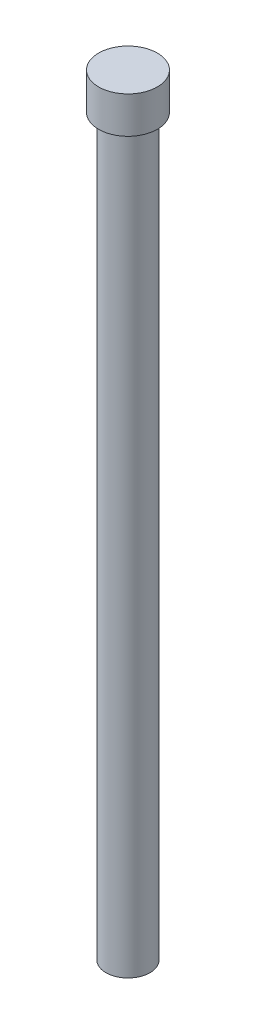
ISO-10303-21;
HEADER;
FILE_DESCRIPTION(('STEP AP214'),'2;1');
FILE_NAME('part.step','',(''),(''),'','','');
FILE_SCHEMA(('AUTOMOTIVE_DESIGN { 1 0 10303 214 1 1 1 1 }'));
ENDSEC;
DATA;
#1=APPLICATION_CONTEXT('core data for automotive mechanical design processes');
#2=APPLICATION_PROTOCOL_DEFINITION('international standard','automotive_design',2000,#1);
#3=PRODUCT_CONTEXT('',#1,'mechanical');
#4=PRODUCT('Part','Part','',(#3));
#5=PRODUCT_RELATED_PRODUCT_CATEGORY('part','',(#4));
#6=PRODUCT_DEFINITION_FORMATION('','',#4);
#7=PRODUCT_DEFINITION_CONTEXT('part definition',#1,'design');
#8=PRODUCT_DEFINITION('design','',#6,#7);
#9=PRODUCT_DEFINITION_SHAPE('','',#8);
#10=(LENGTH_UNIT() NAMED_UNIT(*) SI_UNIT(.MILLI.,.METRE.));
#11=(NAMED_UNIT(*) PLANE_ANGLE_UNIT() SI_UNIT($,.RADIAN.));
#12=(NAMED_UNIT(*) SI_UNIT($,.STERADIAN.) SOLID_ANGLE_UNIT());
#13=UNCERTAINTY_MEASURE_WITH_UNIT(LENGTH_MEASURE(1.E-05),#10,'distance_accuracy_value','');
#14=(GEOMETRIC_REPRESENTATION_CONTEXT(3) GLOBAL_UNCERTAINTY_ASSIGNED_CONTEXT((#13)) GLOBAL_UNIT_ASSIGNED_CONTEXT((#10,
#11,#12)) REPRESENTATION_CONTEXT('',''));
#15=CARTESIAN_POINT('',(0.,0.,0.));
#16=DIRECTION('',(0.,0.,1.));
#17=DIRECTION('',(1.,0.,0.));
#18=AXIS2_PLACEMENT_3D('',#15,#16,#17);
#19=CARTESIAN_POINT('',(0.,25.4,0.));
#20=DIRECTION('',(0.,-1.,0.));
#21=DIRECTION('',(0.,0.,-1.));
#22=AXIS2_PLACEMENT_3D('',#19,#20,#21);
#23=CYLINDRICAL_SURFACE('',#22,0.762);
#24=CARTESIAN_POINT('',(0.,25.4,0.));
#25=DIRECTION('',(0.,1.,0.));
#26=DIRECTION('',(0.,0.,1.));
#27=AXIS2_PLACEMENT_3D('',#24,#25,#26);
#28=CIRCLE('',#27,0.762);
#29=CARTESIAN_POINT('',(0.,25.4,0.762));
#30=VERTEX_POINT('',#29);
#31=EDGE_CURVE('E10',#30,#30,#28,.T.);
#32=ORIENTED_EDGE('',*,*,#31,.F.);
#33=EDGE_LOOP('',(#32));
#34=FACE_BOUND('',#33,.T.);
#35=CARTESIAN_POINT('',(0.,0.,0.));
#36=DIRECTION('',(0.,1.,0.));
#37=DIRECTION('',(0.,0.,1.));
#38=AXIS2_PLACEMENT_3D('',#35,#36,#37);
#39=CIRCLE('',#38,0.762);
#40=CARTESIAN_POINT('',(0.,0.,0.762));
#41=VERTEX_POINT('',#40);
#42=EDGE_CURVE('E34',#41,#41,#39,.T.);
#43=ORIENTED_EDGE('',*,*,#42,.T.);
#44=EDGE_LOOP('',(#43));
#45=FACE_BOUND('',#44,.T.);
#46=ADVANCED_FACE('F31',(#34,#45),#23,.T.);
#47=CARTESIAN_POINT('',(0.,0.,0.));
#48=DIRECTION('',(0.,1.,0.));
#49=DIRECTION('',(0.,0.,1.));
#50=AXIS2_PLACEMENT_3D('',#47,#48,#49);
#51=PLANE('',#50);
#52=ORIENTED_EDGE('',*,*,#42,.F.);
#53=EDGE_LOOP('',(#52));
#54=FACE_BOUND('',#53,.T.);
#55=ADVANCED_FACE('F54',(#54),#51,.F.);
#56=CARTESIAN_POINT('',(0.,26.67,0.));
#57=DIRECTION('',(0.,-1.,0.));
#58=DIRECTION('',(0.,0.,-1.));
#59=AXIS2_PLACEMENT_3D('',#56,#57,#58);
#60=CYLINDRICAL_SURFACE('',#59,1.016);
#61=CARTESIAN_POINT('',(0.,26.67,0.));
#62=DIRECTION('',(0.,1.,0.));
#63=DIRECTION('',(0.,0.,1.));
#64=AXIS2_PLACEMENT_3D('',#61,#62,#63);
#65=CIRCLE('',#64,1.016);
#66=CARTESIAN_POINT('',(0.,26.67,1.016));
#67=VERTEX_POINT('',#66);
#68=EDGE_CURVE('E41',#67,#67,#65,.T.);
#69=ORIENTED_EDGE('',*,*,#68,.F.);
#70=EDGE_LOOP('',(#69));
#71=FACE_BOUND('',#70,.T.);
#72=CARTESIAN_POINT('',(0.,25.4,0.));
#73=DIRECTION('',(0.,1.,0.));
#74=DIRECTION('',(0.,0.,1.));
#75=AXIS2_PLACEMENT_3D('',#72,#73,#74);
#76=CIRCLE('',#75,1.016);
#77=CARTESIAN_POINT('',(0.,25.4,1.016));
#78=VERTEX_POINT('',#77);
#79=EDGE_CURVE('E43',#78,#78,#76,.T.);
#80=ORIENTED_EDGE('',*,*,#79,.T.);
#81=EDGE_LOOP('',(#80));
#82=FACE_BOUND('',#81,.T.);
#83=ADVANCED_FACE('F51',(#71,#82),#60,.T.);
#84=CARTESIAN_POINT('',(0.,26.67,0.));
#85=DIRECTION('',(0.,1.,0.));
#86=DIRECTION('',(0.,0.,1.));
#87=AXIS2_PLACEMENT_3D('',#84,#85,#86);
#88=PLANE('',#87);
#89=ORIENTED_EDGE('',*,*,#68,.T.);
#90=EDGE_LOOP('',(#89));
#91=FACE_BOUND('',#90,.T.);
#92=ADVANCED_FACE('F49',(#91),#88,.T.);
#93=CARTESIAN_POINT('',(0.,25.4,0.));
#94=DIRECTION('',(0.,1.,0.));
#95=DIRECTION('',(0.,0.,1.));
#96=AXIS2_PLACEMENT_3D('',#93,#94,#95);
#97=PLANE('',#96);
#98=ORIENTED_EDGE('',*,*,#31,.T.);
#99=EDGE_LOOP('',(#98));
#100=FACE_BOUND('',#99,.T.);
#101=ORIENTED_EDGE('',*,*,#79,.F.);
#102=EDGE_LOOP('',(#101));
#103=FACE_BOUND('',#102,.T.);
#104=ADVANCED_FACE('F58',(#100,#103),#97,.F.);
#105=CLOSED_SHELL('',(#46,#55,#83,#92,#104));
#106=MANIFOLD_SOLID_BREP('B2',#105);
#107=ADVANCED_BREP_SHAPE_REPRESENTATION('',(#18,#106),#14);
#108=SHAPE_DEFINITION_REPRESENTATION(#9,#107);
ENDSEC;
END-ISO-10303-21;
